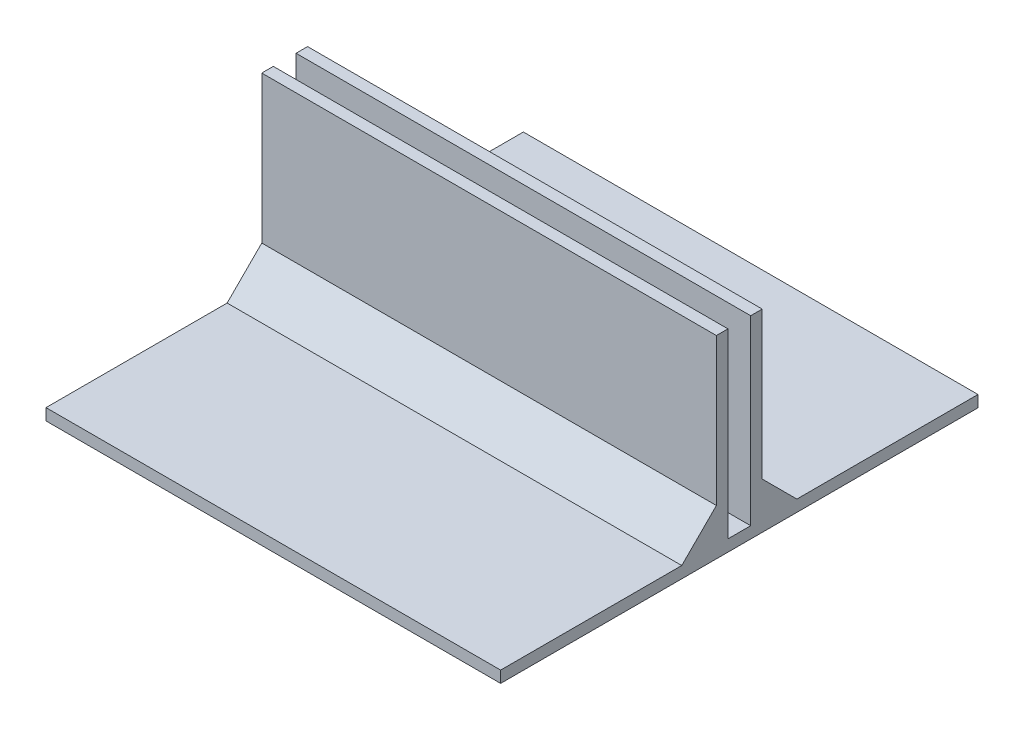
ISO-10303-21;
HEADER;
FILE_DESCRIPTION(('STEP AP214'),'2;1');
FILE_NAME('part.step','',(''),(''),'','','');
FILE_SCHEMA(('AUTOMOTIVE_DESIGN { 1 0 10303 214 1 1 1 1 }'));
ENDSEC;
DATA;
#1=APPLICATION_CONTEXT('core data for automotive mechanical design processes');
#2=APPLICATION_PROTOCOL_DEFINITION('international standard','automotive_design',2000,#1);
#3=PRODUCT_CONTEXT('',#1,'mechanical');
#4=PRODUCT('Part','Part','',(#3));
#5=PRODUCT_RELATED_PRODUCT_CATEGORY('part','',(#4));
#6=PRODUCT_DEFINITION_FORMATION('','',#4);
#7=PRODUCT_DEFINITION_CONTEXT('part definition',#1,'design');
#8=PRODUCT_DEFINITION('design','',#6,#7);
#9=PRODUCT_DEFINITION_SHAPE('','',#8);
#10=(LENGTH_UNIT() NAMED_UNIT(*) SI_UNIT(.MILLI.,.METRE.));
#11=(NAMED_UNIT(*) PLANE_ANGLE_UNIT() SI_UNIT($,.RADIAN.));
#12=(NAMED_UNIT(*) SI_UNIT($,.STERADIAN.) SOLID_ANGLE_UNIT());
#13=UNCERTAINTY_MEASURE_WITH_UNIT(LENGTH_MEASURE(1.E-05),#10,'distance_accuracy_value','');
#14=(GEOMETRIC_REPRESENTATION_CONTEXT(3) GLOBAL_UNCERTAINTY_ASSIGNED_CONTEXT((#13)) GLOBAL_UNIT_ASSIGNED_CONTEXT((#10,
#11,#12)) REPRESENTATION_CONTEXT('',''));
#15=CARTESIAN_POINT('',(0.,0.,0.));
#16=DIRECTION('',(0.,0.,1.));
#17=DIRECTION('',(1.,0.,0.));
#18=AXIS2_PLACEMENT_3D('',#15,#16,#17);
#19=CARTESIAN_POINT('',(0.,2.54,0.));
#20=DIRECTION('',(0.,-1.,0.));
#21=DIRECTION('',(0.,0.,-1.));
#22=AXIS2_PLACEMENT_3D('',#19,#20,#21);
#23=PLANE('',#22);
#24=DIRECTION('',(0.,0.,-1.));
#25=VECTOR('',#24,1.);
#26=CARTESIAN_POINT('',(50.,2.54,52.5));
#27=LINE('',#26,#25);
#28=CARTESIAN_POINT('',(50.,2.54,52.5));
#29=VERTEX_POINT('',#28);
#30=CARTESIAN_POINT('',(50.,2.54,12.6600000000001));
#31=VERTEX_POINT('',#30);
#32=EDGE_CURVE('E191',#29,#31,#27,.T.);
#33=ORIENTED_EDGE('',*,*,#32,.T.);
#34=DIRECTION('',(-1.,0.,0.));
#35=VECTOR('',#34,1.);
#36=CARTESIAN_POINT('',(-50.,2.54,12.6600000000001));
#37=LINE('',#36,#35);
#38=CARTESIAN_POINT('',(-50.,2.54,12.6600000000001));
#39=VERTEX_POINT('',#38);
#40=EDGE_CURVE('E58',#31,#39,#37,.T.);
#41=ORIENTED_EDGE('',*,*,#40,.T.);
#42=DIRECTION('',(0.,0.,1.));
#43=VECTOR('',#42,1.);
#44=CARTESIAN_POINT('',(-50.,2.54,52.5));
#45=LINE('',#44,#43);
#46=CARTESIAN_POINT('',(-50.,2.54,52.5));
#47=VERTEX_POINT('',#46);
#48=EDGE_CURVE('E197',#39,#47,#45,.T.);
#49=ORIENTED_EDGE('',*,*,#48,.T.);
#50=DIRECTION('',(1.,0.,0.));
#51=VECTOR('',#50,1.);
#52=CARTESIAN_POINT('',(-50.,2.54,52.5));
#53=LINE('',#52,#51);
#54=EDGE_CURVE('E201',#47,#29,#53,.T.);
#55=ORIENTED_EDGE('',*,*,#54,.T.);
#56=EDGE_LOOP('',(#33,#41,#49,#55));
#57=FACE_BOUND('',#56,.T.);
#58=ADVANCED_FACE('F37',(#57),#23,.F.);
#59=CARTESIAN_POINT('',(-50.,2.54,-2.5));
#60=VERTEX_POINT('',#59);
#61=CARTESIAN_POINT('',(-50.,2.54,2.5));
#62=VERTEX_POINT('',#61);
#63=EDGE_CURVE('E202',#60,#62,#45,.T.);
#64=ORIENTED_EDGE('',*,*,#63,.T.);
#65=DIRECTION('',(1.,0.,0.));
#66=VECTOR('',#65,1.);
#67=CARTESIAN_POINT('',(0.,2.54,2.5));
#68=LINE('',#67,#66);
#69=CARTESIAN_POINT('',(50.,2.54,2.5));
#70=VERTEX_POINT('',#69);
#71=EDGE_CURVE('E157',#62,#70,#68,.T.);
#72=ORIENTED_EDGE('',*,*,#71,.T.);
#73=CARTESIAN_POINT('',(50.,2.54,-2.5));
#74=VERTEX_POINT('',#73);
#75=EDGE_CURVE('E194',#70,#74,#27,.T.);
#76=ORIENTED_EDGE('',*,*,#75,.T.);
#77=DIRECTION('',(1.,0.,0.));
#78=VECTOR('',#77,1.);
#79=CARTESIAN_POINT('',(0.,2.54,-2.5));
#80=LINE('',#79,#78);
#81=EDGE_CURVE('E161',#60,#74,#80,.T.);
#82=ORIENTED_EDGE('',*,*,#81,.F.);
#83=EDGE_LOOP('',(#64,#72,#76,#82));
#84=FACE_BOUND('',#83,.T.);
#85=ADVANCED_FACE('F266',(#84),#23,.F.);
#86=CARTESIAN_POINT('',(50.,2.54,52.5));
#87=DIRECTION('',(-1.,0.,0.));
#88=DIRECTION('',(0.,0.,1.));
#89=AXIS2_PLACEMENT_3D('',#86,#87,#88);
#90=PLANE('',#89);
#91=DIRECTION('',(0.,0.,-1.));
#92=VECTOR('',#91,1.);
#93=CARTESIAN_POINT('',(50.,0.,52.5));
#94=LINE('',#93,#92);
#95=CARTESIAN_POINT('',(50.,0.,52.5));
#96=VERTEX_POINT('',#95);
#97=CARTESIAN_POINT('',(50.,0.,-52.5));
#98=VERTEX_POINT('',#97);
#99=EDGE_CURVE('E190',#96,#98,#94,.T.);
#100=ORIENTED_EDGE('',*,*,#99,.T.);
#101=DIRECTION('',(0.,-1.,0.));
#102=VECTOR('',#101,1.);
#103=CARTESIAN_POINT('',(50.,2.54,-52.5));
#104=LINE('',#103,#102);
#105=CARTESIAN_POINT('',(50.,2.54,-52.5));
#106=VERTEX_POINT('',#105);
#107=EDGE_CURVE('E221',#106,#98,#104,.T.);
#108=ORIENTED_EDGE('',*,*,#107,.F.);
#109=CARTESIAN_POINT('',(50.,2.54,-12.6600000000001));
#110=VERTEX_POINT('',#109);
#111=EDGE_CURVE('E195',#110,#106,#27,.T.);
#112=ORIENTED_EDGE('',*,*,#111,.F.);
#113=DIRECTION('',(0.,0.707106781186544,0.707106781186551));
#114=VECTOR('',#113,1.);
#115=CARTESIAN_POINT('',(50.,35.12,19.9200000000003));
#116=LINE('',#115,#114);
#117=CARTESIAN_POINT('',(50.,10.16,-5.04));
#118=VERTEX_POINT('',#117);
#119=EDGE_CURVE('E232',#110,#118,#116,.T.);
#120=ORIENTED_EDGE('',*,*,#119,.T.);
#121=DIRECTION('',(0.,-1.,0.));
#122=VECTOR('',#121,1.);
#123=CARTESIAN_POINT('',(50.,42.54,-5.04));
#124=LINE('',#123,#122);
#125=CARTESIAN_POINT('',(50.,42.54,-5.04));
#126=VERTEX_POINT('',#125);
#127=EDGE_CURVE('E177',#126,#118,#124,.T.);
#128=ORIENTED_EDGE('',*,*,#127,.F.);
#129=DIRECTION('',(0.,0.,-1.));
#130=VECTOR('',#129,1.);
#131=CARTESIAN_POINT('',(50.,42.54,0.));
#132=LINE('',#131,#130);
#133=CARTESIAN_POINT('',(50.,42.54,-2.5));
#134=VERTEX_POINT('',#133);
#135=EDGE_CURVE('E176',#134,#126,#132,.T.);
#136=ORIENTED_EDGE('',*,*,#135,.F.);
#137=DIRECTION('',(0.,-1.,0.));
#138=VECTOR('',#137,1.);
#139=CARTESIAN_POINT('',(50.,42.54,-2.5));
#140=LINE('',#139,#138);
#141=EDGE_CURVE('E181',#134,#74,#140,.T.);
#142=ORIENTED_EDGE('',*,*,#141,.T.);
#143=ORIENTED_EDGE('',*,*,#75,.F.);
#144=DIRECTION('',(0.,-1.,0.));
#145=VECTOR('',#144,1.);
#146=CARTESIAN_POINT('',(50.,42.54,2.5));
#147=LINE('',#146,#145);
#148=CARTESIAN_POINT('',(50.,42.54,2.5));
#149=VERTEX_POINT('',#148);
#150=EDGE_CURVE('E166',#149,#70,#147,.T.);
#151=ORIENTED_EDGE('',*,*,#150,.F.);
#152=DIRECTION('',(0.,0.,-1.));
#153=VECTOR('',#152,1.);
#154=CARTESIAN_POINT('',(50.,42.54,0.));
#155=LINE('',#154,#153);
#156=CARTESIAN_POINT('',(50.,42.54,5.04));
#157=VERTEX_POINT('',#156);
#158=EDGE_CURVE('E147',#157,#149,#155,.T.);
#159=ORIENTED_EDGE('',*,*,#158,.F.);
#160=DIRECTION('',(0.,-1.,0.));
#161=VECTOR('',#160,1.);
#162=CARTESIAN_POINT('',(50.,42.54,5.04));
#163=LINE('',#162,#161);
#164=CARTESIAN_POINT('',(50.,10.16,5.04));
#165=VERTEX_POINT('',#164);
#166=EDGE_CURVE('E144',#157,#165,#163,.T.);
#167=ORIENTED_EDGE('',*,*,#166,.T.);
#168=DIRECTION('',(0.,0.707106781186544,-0.707106781186551));
#169=VECTOR('',#168,1.);
#170=CARTESIAN_POINT('',(50.,-17.38,32.5800000000003));
#171=LINE('',#170,#169);
#172=EDGE_CURVE('E45',#165,#31,#171,.F.);
#173=ORIENTED_EDGE('',*,*,#172,.T.);
#174=ORIENTED_EDGE('',*,*,#32,.F.);
#175=DIRECTION('',(0.,-1.,0.));
#176=VECTOR('',#175,1.);
#177=CARTESIAN_POINT('',(50.,2.54,52.5));
#178=LINE('',#177,#176);
#179=EDGE_CURVE('E204',#29,#96,#178,.T.);
#180=ORIENTED_EDGE('',*,*,#179,.T.);
#181=EDGE_LOOP('',(#100,#108,#112,#120,#128,#136,#142,#143,#151,#159,#167,#173,#174,#180));
#182=FACE_BOUND('',#181,.T.);
#183=ADVANCED_FACE('F248',(#182),#90,.F.);
#184=CARTESIAN_POINT('',(-50.,2.54,-52.5));
#185=DIRECTION('',(0.,0.,1.));
#186=DIRECTION('',(1.,0.,0.));
#187=AXIS2_PLACEMENT_3D('',#184,#185,#186);
#188=PLANE('',#187);
#189=DIRECTION('',(-1.,0.,0.));
#190=VECTOR('',#189,1.);
#191=CARTESIAN_POINT('',(-50.,0.,-52.5));
#192=LINE('',#191,#190);
#193=CARTESIAN_POINT('',(-50.,0.,-52.5));
#194=VERTEX_POINT('',#193);
#195=EDGE_CURVE('E207',#98,#194,#192,.T.);
#196=ORIENTED_EDGE('',*,*,#195,.T.);
#197=DIRECTION('',(0.,-1.,0.));
#198=VECTOR('',#197,1.);
#199=CARTESIAN_POINT('',(-50.,2.54,-52.5));
#200=LINE('',#199,#198);
#201=CARTESIAN_POINT('',(-50.,2.54,-52.5));
#202=VERTEX_POINT('',#201);
#203=EDGE_CURVE('E218',#202,#194,#200,.T.);
#204=ORIENTED_EDGE('',*,*,#203,.F.);
#205=DIRECTION('',(-1.,0.,0.));
#206=VECTOR('',#205,1.);
#207=CARTESIAN_POINT('',(-50.,2.54,-52.5));
#208=LINE('',#207,#206);
#209=EDGE_CURVE('E193',#106,#202,#208,.T.);
#210=ORIENTED_EDGE('',*,*,#209,.F.);
#211=ORIENTED_EDGE('',*,*,#107,.T.);
#212=EDGE_LOOP('',(#196,#204,#210,#211));
#213=FACE_BOUND('',#212,.T.);
#214=ADVANCED_FACE('F310',(#213),#188,.F.);
#215=CARTESIAN_POINT('',(-50.,2.54,52.5));
#216=DIRECTION('',(1.,0.,0.));
#217=DIRECTION('',(0.,0.,-1.));
#218=AXIS2_PLACEMENT_3D('',#215,#216,#217);
#219=PLANE('',#218);
#220=DIRECTION('',(0.,0.,1.));
#221=VECTOR('',#220,1.);
#222=CARTESIAN_POINT('',(-50.,0.,52.5));
#223=LINE('',#222,#221);
#224=CARTESIAN_POINT('',(-50.,0.,52.5));
#225=VERTEX_POINT('',#224);
#226=EDGE_CURVE('E209',#194,#225,#223,.T.);
#227=ORIENTED_EDGE('',*,*,#226,.T.);
#228=DIRECTION('',(0.,-1.,0.));
#229=VECTOR('',#228,1.);
#230=CARTESIAN_POINT('',(-50.,2.54,52.5));
#231=LINE('',#230,#229);
#232=EDGE_CURVE('E215',#47,#225,#231,.T.);
#233=ORIENTED_EDGE('',*,*,#232,.F.);
#234=ORIENTED_EDGE('',*,*,#48,.F.);
#235=DIRECTION('',(0.,-0.707106781186544,0.707106781186551));
#236=VECTOR('',#235,1.);
#237=CARTESIAN_POINT('',(-50.,-17.38,32.5800000000003));
#238=LINE('',#237,#236);
#239=CARTESIAN_POINT('',(-50.,10.16,5.04));
#240=VERTEX_POINT('',#239);
#241=EDGE_CURVE('E11',#39,#240,#238,.F.);
#242=ORIENTED_EDGE('',*,*,#241,.T.);
#243=DIRECTION('',(0.,-1.,0.));
#244=VECTOR('',#243,1.);
#245=CARTESIAN_POINT('',(-50.,42.54,5.04));
#246=LINE('',#245,#244);
#247=CARTESIAN_POINT('',(-50.,42.54,5.04));
#248=VERTEX_POINT('',#247);
#249=EDGE_CURVE('E142',#248,#240,#246,.T.);
#250=ORIENTED_EDGE('',*,*,#249,.F.);
#251=DIRECTION('',(0.,0.,1.));
#252=VECTOR('',#251,1.);
#253=CARTESIAN_POINT('',(-50.,42.54,0.));
#254=LINE('',#253,#252);
#255=CARTESIAN_POINT('',(-50.,42.54,2.5));
#256=VERTEX_POINT('',#255);
#257=EDGE_CURVE('E148',#256,#248,#254,.T.);
#258=ORIENTED_EDGE('',*,*,#257,.F.);
#259=DIRECTION('',(0.,-1.,0.));
#260=VECTOR('',#259,1.);
#261=CARTESIAN_POINT('',(-50.,42.54,2.5));
#262=LINE('',#261,#260);
#263=EDGE_CURVE('E267',#256,#62,#262,.T.);
#264=ORIENTED_EDGE('',*,*,#263,.T.);
#265=ORIENTED_EDGE('',*,*,#63,.F.);
#266=DIRECTION('',(0.,-1.,0.));
#267=VECTOR('',#266,1.);
#268=CARTESIAN_POINT('',(-50.,42.54,-2.5));
#269=LINE('',#268,#267);
#270=CARTESIAN_POINT('',(-50.,42.54,-2.5));
#271=VERTEX_POINT('',#270);
#272=EDGE_CURVE('E184',#271,#60,#269,.T.);
#273=ORIENTED_EDGE('',*,*,#272,.F.);
#274=DIRECTION('',(0.,0.,1.));
#275=VECTOR('',#274,1.);
#276=CARTESIAN_POINT('',(-50.,42.54,0.));
#277=LINE('',#276,#275);
#278=CARTESIAN_POINT('',(-50.,42.54,-5.04));
#279=VERTEX_POINT('',#278);
#280=EDGE_CURVE('E172',#279,#271,#277,.T.);
#281=ORIENTED_EDGE('',*,*,#280,.F.);
#282=DIRECTION('',(0.,-1.,0.));
#283=VECTOR('',#282,1.);
#284=CARTESIAN_POINT('',(-50.,42.54,-5.04));
#285=LINE('',#284,#283);
#286=CARTESIAN_POINT('',(-50.,10.16,-5.04));
#287=VERTEX_POINT('',#286);
#288=EDGE_CURVE('E187',#279,#287,#285,.T.);
#289=ORIENTED_EDGE('',*,*,#288,.T.);
#290=DIRECTION('',(0.,-0.707106781186544,-0.707106781186551));
#291=VECTOR('',#290,1.);
#292=CARTESIAN_POINT('',(-50.,35.12,19.9200000000003));
#293=LINE('',#292,#291);
#294=CARTESIAN_POINT('',(-50.,2.54,-12.6600000000001));
#295=VERTEX_POINT('',#294);
#296=EDGE_CURVE('E234',#287,#295,#293,.T.);
#297=ORIENTED_EDGE('',*,*,#296,.T.);
#298=EDGE_CURVE('E198',#202,#295,#45,.T.);
#299=ORIENTED_EDGE('',*,*,#298,.F.);
#300=ORIENTED_EDGE('',*,*,#203,.T.);
#301=EDGE_LOOP('',(#227,#233,#234,#242,#250,#258,#264,#265,#273,#281,#289,#297,#299,#300));
#302=FACE_BOUND('',#301,.T.);
#303=ADVANCED_FACE('F159',(#302),#219,.F.);
#304=CARTESIAN_POINT('',(-50.,2.54,52.5));
#305=DIRECTION('',(0.,0.,-1.));
#306=DIRECTION('',(-1.,0.,0.));
#307=AXIS2_PLACEMENT_3D('',#304,#305,#306);
#308=PLANE('',#307);
#309=DIRECTION('',(1.,0.,0.));
#310=VECTOR('',#309,1.);
#311=CARTESIAN_POINT('',(-50.,0.,52.5));
#312=LINE('',#311,#310);
#313=EDGE_CURVE('E211',#225,#96,#312,.T.);
#314=ORIENTED_EDGE('',*,*,#313,.T.);
#315=ORIENTED_EDGE('',*,*,#179,.F.);
#316=ORIENTED_EDGE('',*,*,#54,.F.);
#317=ORIENTED_EDGE('',*,*,#232,.T.);
#318=EDGE_LOOP('',(#314,#315,#316,#317));
#319=FACE_BOUND('',#318,.T.);
#320=ADVANCED_FACE('F275',(#319),#308,.F.);
#321=ORIENTED_EDGE('',*,*,#298,.T.);
#322=DIRECTION('',(1.,0.,0.));
#323=VECTOR('',#322,1.);
#324=CARTESIAN_POINT('',(0.,2.54,-12.6600000000001));
#325=LINE('',#324,#323);
#326=EDGE_CURVE('E224',#295,#110,#325,.T.);
#327=ORIENTED_EDGE('',*,*,#326,.T.);
#328=ORIENTED_EDGE('',*,*,#111,.T.);
#329=ORIENTED_EDGE('',*,*,#209,.T.);
#330=EDGE_LOOP('',(#321,#327,#328,#329));
#331=FACE_BOUND('',#330,.T.);
#332=ADVANCED_FACE('F242',(#331),#23,.F.);
#333=CARTESIAN_POINT('',(0.,0.,0.));
#334=DIRECTION('',(0.,-1.,0.));
#335=DIRECTION('',(0.,0.,-1.));
#336=AXIS2_PLACEMENT_3D('',#333,#334,#335);
#337=PLANE('',#336);
#338=ORIENTED_EDGE('',*,*,#99,.F.);
#339=ORIENTED_EDGE('',*,*,#313,.F.);
#340=ORIENTED_EDGE('',*,*,#226,.F.);
#341=ORIENTED_EDGE('',*,*,#195,.F.);
#342=EDGE_LOOP('',(#338,#339,#340,#341));
#343=FACE_BOUND('',#342,.T.);
#344=ADVANCED_FACE('F300',(#343),#337,.T.);
#345=CARTESIAN_POINT('',(0.,42.54,-5.04));
#346=DIRECTION('',(0.,0.,-1.));
#347=DIRECTION('',(-1.,0.,0.));
#348=AXIS2_PLACEMENT_3D('',#345,#346,#347);
#349=PLANE('',#348);
#350=ORIENTED_EDGE('',*,*,#127,.T.);
#351=DIRECTION('',(-1.,0.,0.));
#352=VECTOR('',#351,1.);
#353=CARTESIAN_POINT('',(0.,10.16,-5.04));
#354=LINE('',#353,#352);
#355=EDGE_CURVE('E227',#118,#287,#354,.T.);
#356=ORIENTED_EDGE('',*,*,#355,.T.);
#357=ORIENTED_EDGE('',*,*,#288,.F.);
#358=DIRECTION('',(1.,0.,0.));
#359=VECTOR('',#358,1.);
#360=CARTESIAN_POINT('',(0.,42.54,-5.04));
#361=LINE('',#360,#359);
#362=EDGE_CURVE('E164',#279,#126,#361,.T.);
#363=ORIENTED_EDGE('',*,*,#362,.T.);
#364=EDGE_LOOP('',(#350,#356,#357,#363));
#365=FACE_BOUND('',#364,.T.);
#366=ADVANCED_FACE('F252',(#365),#349,.T.);
#367=CARTESIAN_POINT('',(0.,42.54,-2.5));
#368=DIRECTION('',(0.,0.,-1.));
#369=DIRECTION('',(-1.,0.,0.));
#370=AXIS2_PLACEMENT_3D('',#367,#368,#369);
#371=PLANE('',#370);
#372=ORIENTED_EDGE('',*,*,#81,.T.);
#373=ORIENTED_EDGE('',*,*,#141,.F.);
#374=DIRECTION('',(1.,0.,0.));
#375=VECTOR('',#374,1.);
#376=CARTESIAN_POINT('',(0.,42.54,-2.5));
#377=LINE('',#376,#375);
#378=EDGE_CURVE('E174',#271,#134,#377,.T.);
#379=ORIENTED_EDGE('',*,*,#378,.F.);
#380=ORIENTED_EDGE('',*,*,#272,.T.);
#381=EDGE_LOOP('',(#372,#373,#379,#380));
#382=FACE_BOUND('',#381,.T.);
#383=ADVANCED_FACE('F263',(#382),#371,.F.);
#384=CARTESIAN_POINT('',(0.,42.54,0.));
#385=DIRECTION('',(0.,1.,0.));
#386=DIRECTION('',(0.,0.,1.));
#387=AXIS2_PLACEMENT_3D('',#384,#385,#386);
#388=PLANE('',#387);
#389=ORIENTED_EDGE('',*,*,#362,.F.);
#390=ORIENTED_EDGE('',*,*,#280,.T.);
#391=ORIENTED_EDGE('',*,*,#378,.T.);
#392=ORIENTED_EDGE('',*,*,#135,.T.);
#393=EDGE_LOOP('',(#389,#390,#391,#392));
#394=FACE_BOUND('',#393,.T.);
#395=ADVANCED_FACE('F255',(#394),#388,.T.);
#396=CARTESIAN_POINT('',(0.,42.54,5.04));
#397=DIRECTION('',(0.,0.,-1.));
#398=DIRECTION('',(-1.,0.,0.));
#399=AXIS2_PLACEMENT_3D('',#396,#397,#398);
#400=PLANE('',#399);
#401=ORIENTED_EDGE('',*,*,#249,.T.);
#402=DIRECTION('',(1.,0.,0.));
#403=VECTOR('',#402,1.);
#404=CARTESIAN_POINT('',(50.,10.16,5.04));
#405=LINE('',#404,#403);
#406=EDGE_CURVE('E229',#240,#165,#405,.T.);
#407=ORIENTED_EDGE('',*,*,#406,.T.);
#408=ORIENTED_EDGE('',*,*,#166,.F.);
#409=DIRECTION('',(1.,0.,0.));
#410=VECTOR('',#409,1.);
#411=CARTESIAN_POINT('',(0.,42.54,5.04));
#412=LINE('',#411,#410);
#413=EDGE_CURVE('E137',#248,#157,#412,.T.);
#414=ORIENTED_EDGE('',*,*,#413,.F.);
#415=EDGE_LOOP('',(#401,#407,#408,#414));
#416=FACE_BOUND('',#415,.T.);
#417=ADVANCED_FACE('F139',(#416),#400,.F.);
#418=CARTESIAN_POINT('',(0.,42.54,2.5));
#419=DIRECTION('',(0.,0.,-1.));
#420=DIRECTION('',(-1.,0.,0.));
#421=AXIS2_PLACEMENT_3D('',#418,#419,#420);
#422=PLANE('',#421);
#423=ORIENTED_EDGE('',*,*,#71,.F.);
#424=ORIENTED_EDGE('',*,*,#263,.F.);
#425=DIRECTION('',(1.,0.,0.));
#426=VECTOR('',#425,1.);
#427=CARTESIAN_POINT('',(0.,42.54,2.5));
#428=LINE('',#427,#426);
#429=EDGE_CURVE('E154',#256,#149,#428,.T.);
#430=ORIENTED_EDGE('',*,*,#429,.T.);
#431=ORIENTED_EDGE('',*,*,#150,.T.);
#432=EDGE_LOOP('',(#423,#424,#430,#431));
#433=FACE_BOUND('',#432,.T.);
#434=ADVANCED_FACE('F283',(#433),#422,.T.);
#435=CARTESIAN_POINT('',(0.,42.54,0.));
#436=DIRECTION('',(0.,1.,0.));
#437=DIRECTION('',(0.,0.,1.));
#438=AXIS2_PLACEMENT_3D('',#435,#436,#437);
#439=PLANE('',#438);
#440=ORIENTED_EDGE('',*,*,#257,.T.);
#441=ORIENTED_EDGE('',*,*,#413,.T.);
#442=ORIENTED_EDGE('',*,*,#158,.T.);
#443=ORIENTED_EDGE('',*,*,#429,.F.);
#444=EDGE_LOOP('',(#440,#441,#442,#443));
#445=FACE_BOUND('',#444,.T.);
#446=ADVANCED_FACE('F152',(#445),#439,.T.);
#447=CARTESIAN_POINT('',(0.,2.54,-12.6600000000001));
#448=DIRECTION('',(0.,-0.707106781186551,0.707106781186544));
#449=DIRECTION('',(1.,0.,0.));
#450=AXIS2_PLACEMENT_3D('',#447,#448,#449);
#451=PLANE('',#450);
#452=ORIENTED_EDGE('',*,*,#296,.F.);
#453=ORIENTED_EDGE('',*,*,#355,.F.);
#454=ORIENTED_EDGE('',*,*,#119,.F.);
#455=ORIENTED_EDGE('',*,*,#326,.F.);
#456=EDGE_LOOP('',(#452,#453,#454,#455));
#457=FACE_BOUND('',#456,.T.);
#458=ADVANCED_FACE('F246',(#457),#451,.F.);
#459=CARTESIAN_POINT('',(0.,10.16,5.04));
#460=DIRECTION('',(0.,0.707106781186551,0.707106781186544));
#461=DIRECTION('',(-1.,0.,0.));
#462=AXIS2_PLACEMENT_3D('',#459,#460,#461);
#463=PLANE('',#462);
#464=ORIENTED_EDGE('',*,*,#241,.F.);
#465=ORIENTED_EDGE('',*,*,#40,.F.);
#466=ORIENTED_EDGE('',*,*,#172,.F.);
#467=ORIENTED_EDGE('',*,*,#406,.F.);
#468=EDGE_LOOP('',(#464,#465,#466,#467));
#469=FACE_BOUND('',#468,.T.);
#470=ADVANCED_FACE('F39',(#469),#463,.T.);
#471=CLOSED_SHELL('',(#58,#85,#183,#214,#303,#320,#332,#344,#366,#383,#395,#417,#434,#446,#458,#470));
#472=MANIFOLD_SOLID_BREP('B2',#471);
#473=ADVANCED_BREP_SHAPE_REPRESENTATION('',(#18,#472),#14);
#474=SHAPE_DEFINITION_REPRESENTATION(#9,#473);
ENDSEC;
END-ISO-10303-21;
